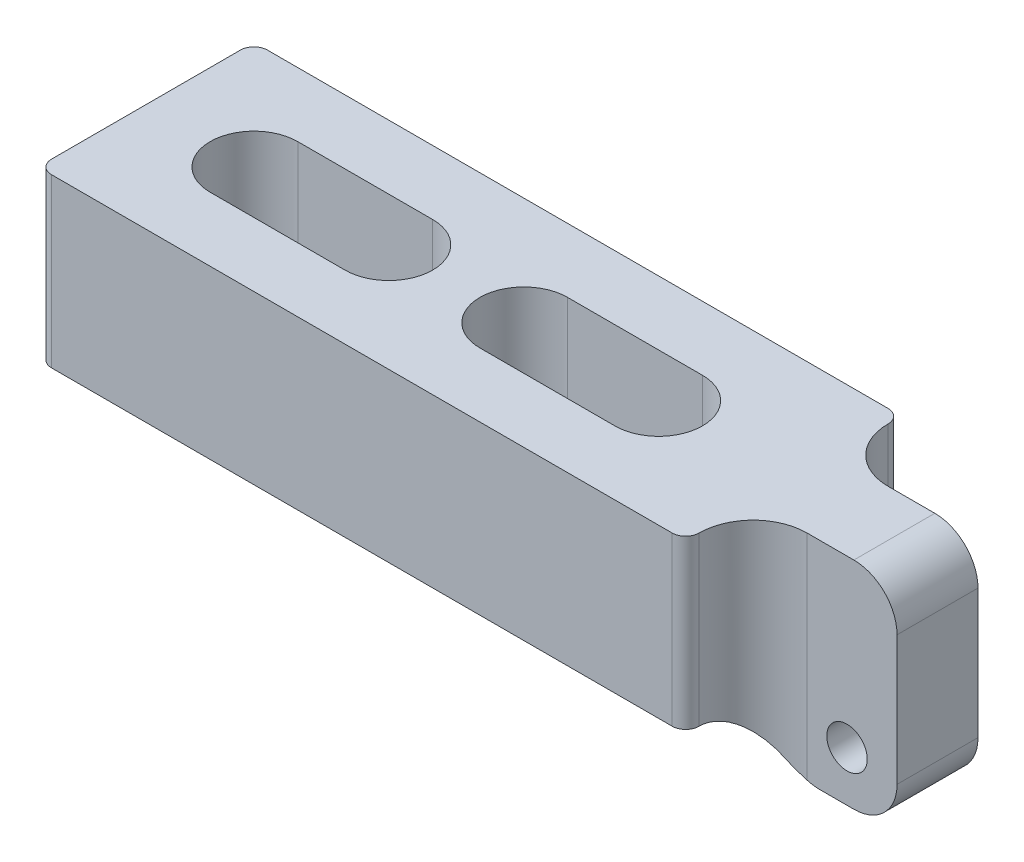
ISO-10303-21;
HEADER;
FILE_DESCRIPTION(('STEP AP214'),'2;1');
FILE_NAME('part.step','',(''),(''),'','','');
FILE_SCHEMA(('AUTOMOTIVE_DESIGN { 1 0 10303 214 1 1 1 1 }'));
ENDSEC;
DATA;
#1=APPLICATION_CONTEXT('core data for automotive mechanical design processes');
#2=APPLICATION_PROTOCOL_DEFINITION('international standard','automotive_design',2000,#1);
#3=PRODUCT_CONTEXT('',#1,'mechanical');
#4=PRODUCT('Part','Part','',(#3));
#5=PRODUCT_RELATED_PRODUCT_CATEGORY('part','',(#4));
#6=PRODUCT_DEFINITION_FORMATION('','',#4);
#7=PRODUCT_DEFINITION_CONTEXT('part definition',#1,'design');
#8=PRODUCT_DEFINITION('design','',#6,#7);
#9=PRODUCT_DEFINITION_SHAPE('','',#8);
#10=(LENGTH_UNIT() NAMED_UNIT(*) SI_UNIT(.MILLI.,.METRE.));
#11=(NAMED_UNIT(*) PLANE_ANGLE_UNIT() SI_UNIT($,.RADIAN.));
#12=(NAMED_UNIT(*) SI_UNIT($,.STERADIAN.) SOLID_ANGLE_UNIT());
#13=UNCERTAINTY_MEASURE_WITH_UNIT(LENGTH_MEASURE(1.E-05),#10,'distance_accuracy_value','');
#14=(GEOMETRIC_REPRESENTATION_CONTEXT(3) GLOBAL_UNCERTAINTY_ASSIGNED_CONTEXT((#13)) GLOBAL_UNIT_ASSIGNED_CONTEXT((#10,
#11,#12)) REPRESENTATION_CONTEXT('',''));
#15=CARTESIAN_POINT('',(0.,0.,0.));
#16=DIRECTION('',(0.,0.,1.));
#17=DIRECTION('',(1.,0.,0.));
#18=AXIS2_PLACEMENT_3D('',#15,#16,#17);
#19=CARTESIAN_POINT('',(0.,0.,12.7));
#20=DIRECTION('',(0.,0.,1.));
#21=DIRECTION('',(1.,0.,0.));
#22=AXIS2_PLACEMENT_3D('',#19,#20,#21);
#23=PLANE('',#22);
#24=DIRECTION('',(1.,0.,0.));
#25=VECTOR('',#24,1.);
#26=CARTESIAN_POINT('',(-43.6237600756682,-0.0889000000000003,12.7));
#27=LINE('',#26,#25);
#28=CARTESIAN_POINT('',(-42.8300100756682,-0.0889000000000003,12.7));
#29=VERTEX_POINT('',#28);
#30=CARTESIAN_POINT('',(-6.31751007566823,-0.0889000000000003,12.7));
#31=VERTEX_POINT('',#30);
#32=EDGE_CURVE('E249',#29,#31,#27,.T.);
#33=ORIENTED_EDGE('',*,*,#32,.T.);
#34=DIRECTION('',(0.,-1.,0.));
#35=VECTOR('',#34,1.);
#36=CARTESIAN_POINT('',(-6.31751007566821,9.75640589577104,12.7));
#37=LINE('',#36,#35);
#38=CARTESIAN_POINT('',(-6.31751007566821,9.75640589577104,12.7));
#39=VERTEX_POINT('',#38);
#40=EDGE_CURVE('E492',#31,#39,#37,.F.);
#41=ORIENTED_EDGE('',*,*,#40,.T.);
#42=DIRECTION('',(-1.,0.,0.));
#43=VECTOR('',#42,1.);
#44=CARTESIAN_POINT('',(2.94359410422896,9.75640589577104,12.7));
#45=LINE('',#44,#43);
#46=CARTESIAN_POINT('',(-42.8300100756682,9.75640589577104,12.7));
#47=VERTEX_POINT('',#46);
#48=EDGE_CURVE('E255',#39,#47,#45,.T.);
#49=ORIENTED_EDGE('',*,*,#48,.T.);
#50=DIRECTION('',(0.,-1.,0.));
#51=VECTOR('',#50,1.);
#52=CARTESIAN_POINT('',(-42.8300100756682,-0.0889000000000003,12.7));
#53=LINE('',#52,#51);
#54=EDGE_CURVE('E489',#47,#29,#53,.T.);
#55=ORIENTED_EDGE('',*,*,#54,.T.);
#56=EDGE_LOOP('',(#33,#41,#49,#55));
#57=FACE_BOUND('',#56,.T.);
#58=ADVANCED_FACE('F37',(#57),#23,.T.);
#59=CARTESIAN_POINT('',(0.,0.,0.));
#60=DIRECTION('',(0.,0.,1.));
#61=DIRECTION('',(1.,0.,0.));
#62=AXIS2_PLACEMENT_3D('',#59,#60,#61);
#63=PLANE('',#62);
#64=DIRECTION('',(-1.,0.,0.));
#65=VECTOR('',#64,1.);
#66=CARTESIAN_POINT('',(2.94359410422896,9.75640589577104,0.));
#67=LINE('',#66,#65);
#68=CARTESIAN_POINT('',(-6.31751007566821,9.75640589577104,0.));
#69=VERTEX_POINT('',#68);
#70=CARTESIAN_POINT('',(-42.8300100756682,9.75640589577104,0.));
#71=VERTEX_POINT('',#70);
#72=EDGE_CURVE('E257',#69,#71,#67,.T.);
#73=ORIENTED_EDGE('',*,*,#72,.F.);
#74=DIRECTION('',(0.,-1.,0.));
#75=VECTOR('',#74,1.);
#76=CARTESIAN_POINT('',(-6.31751007566821,0.,0.));
#77=LINE('',#76,#75);
#78=CARTESIAN_POINT('',(-6.31751007566823,-0.0889000000000003,0.));
#79=VERTEX_POINT('',#78);
#80=EDGE_CURVE('E503',#69,#79,#77,.T.);
#81=ORIENTED_EDGE('',*,*,#80,.T.);
#82=DIRECTION('',(1.,0.,0.));
#83=VECTOR('',#82,1.);
#84=CARTESIAN_POINT('',(-43.6237600756682,-0.0889000000000003,0.));
#85=LINE('',#84,#83);
#86=CARTESIAN_POINT('',(-42.8300100756682,-0.0889000000000003,0.));
#87=VERTEX_POINT('',#86);
#88=EDGE_CURVE('E259',#87,#79,#85,.T.);
#89=ORIENTED_EDGE('',*,*,#88,.F.);
#90=DIRECTION('',(0.,-1.,0.));
#91=VECTOR('',#90,1.);
#92=CARTESIAN_POINT('',(-42.8300100756682,0.,0.));
#93=LINE('',#92,#91);
#94=EDGE_CURVE('E501',#87,#71,#93,.F.);
#95=ORIENTED_EDGE('',*,*,#94,.T.);
#96=EDGE_LOOP('',(#73,#81,#89,#95));
#97=FACE_BOUND('',#96,.T.);
#98=ADVANCED_FACE('F375',(#97),#63,.F.);
#99=CARTESIAN_POINT('',(-2.66906597143926,-2.94359410422896,12.7));
#100=DIRECTION('',(0.,1.,0.));
#101=DIRECTION('',(0.,0.,1.));
#102=AXIS2_PLACEMENT_3D('',#99,#100,#101);
#103=PLANE('',#102);
#104=DIRECTION('',(1.,0.,0.));
#105=VECTOR('',#104,1.);
#106=CARTESIAN_POINT('',(2.94359410422896,-2.94359410422896,8.73125));
#107=LINE('',#106,#105);
#108=CARTESIAN_POINT('',(-1.6169635230116,-2.94359410422896,8.73125));
#109=VERTEX_POINT('',#108);
#110=CARTESIAN_POINT('',(0.403594104228956,-2.94359410422896,8.73125));
#111=VERTEX_POINT('',#110);
#112=EDGE_CURVE('E430',#109,#111,#107,.T.);
#113=ORIENTED_EDGE('',*,*,#112,.F.);
#114=DIRECTION('',(0.,0.,-1.));
#115=VECTOR('',#114,1.);
#116=CARTESIAN_POINT('',(-1.6169635230116,-2.94359410422896,12.7));
#117=LINE('',#116,#115);
#118=CARTESIAN_POINT('',(-1.6169635230116,-2.94359410422896,3.96875));
#119=VERTEX_POINT('',#118);
#120=EDGE_CURVE('E278',#109,#119,#117,.T.);
#121=ORIENTED_EDGE('',*,*,#120,.T.);
#122=DIRECTION('',(-1.,0.,0.));
#123=VECTOR('',#122,1.);
#124=CARTESIAN_POINT('',(2.94359410422896,-2.94359410422896,3.96875));
#125=LINE('',#124,#123);
#126=CARTESIAN_POINT('',(0.403594104228956,-2.94359410422896,3.96875));
#127=VERTEX_POINT('',#126);
#128=EDGE_CURVE('E232',#127,#119,#125,.T.);
#129=ORIENTED_EDGE('',*,*,#128,.F.);
#130=DIRECTION('',(0.,0.,-1.));
#131=VECTOR('',#130,1.);
#132=CARTESIAN_POINT('',(0.403594104228956,-2.94359410422896,12.7));
#133=LINE('',#132,#131);
#134=EDGE_CURVE('E270',#127,#111,#133,.F.);
#135=ORIENTED_EDGE('',*,*,#134,.T.);
#136=EDGE_LOOP('',(#113,#121,#129,#135));
#137=FACE_BOUND('',#136,.T.);
#138=ADVANCED_FACE('F339',(#137),#103,.F.);
#139=CARTESIAN_POINT('',(2.94359410422896,-2.94359410422896,12.7));
#140=DIRECTION('',(-1.,0.,0.));
#141=DIRECTION('',(0.,-1.,0.));
#142=AXIS2_PLACEMENT_3D('',#139,#140,#141);
#143=PLANE('',#142);
#144=DIRECTION('',(0.,-1.,0.));
#145=VECTOR('',#144,1.);
#146=CARTESIAN_POINT('',(2.94359410422896,9.75640589577104,8.73125));
#147=LINE('',#146,#145);
#148=CARTESIAN_POINT('',(2.94359410422896,7.21640589577104,8.73125));
#149=VERTEX_POINT('',#148);
#150=CARTESIAN_POINT('',(2.94359410422896,-0.403594104228957,8.73125));
#151=VERTEX_POINT('',#150);
#152=EDGE_CURVE('E274',#149,#151,#147,.T.);
#153=ORIENTED_EDGE('',*,*,#152,.T.);
#154=DIRECTION('',(0.,0.,-1.));
#155=VECTOR('',#154,1.);
#156=CARTESIAN_POINT('',(2.94359410422896,-0.403594104228956,12.7));
#157=LINE('',#156,#155);
#158=CARTESIAN_POINT('',(2.94359410422896,-0.403594104228957,3.96875));
#159=VERTEX_POINT('',#158);
#160=EDGE_CURVE('E299',#151,#159,#157,.T.);
#161=ORIENTED_EDGE('',*,*,#160,.T.);
#162=DIRECTION('',(0.,-1.,0.));
#163=VECTOR('',#162,1.);
#164=CARTESIAN_POINT('',(2.94359410422896,9.75640589577104,3.96875));
#165=LINE('',#164,#163);
#166=CARTESIAN_POINT('',(2.94359410422896,7.21640589577104,3.96875));
#167=VERTEX_POINT('',#166);
#168=EDGE_CURVE('E422',#167,#159,#165,.T.);
#169=ORIENTED_EDGE('',*,*,#168,.F.);
#170=DIRECTION('',(0.,0.,-1.));
#171=VECTOR('',#170,1.);
#172=CARTESIAN_POINT('',(2.94359410422896,7.21640589577104,12.7));
#173=LINE('',#172,#171);
#174=EDGE_CURVE('E297',#167,#149,#173,.F.);
#175=ORIENTED_EDGE('',*,*,#174,.T.);
#176=EDGE_LOOP('',(#153,#161,#169,#175));
#177=FACE_BOUND('',#176,.T.);
#178=ADVANCED_FACE('F399',(#177),#143,.F.);
#179=CARTESIAN_POINT('',(2.94359410422896,9.75640589577104,12.7));
#180=DIRECTION('',(0.,-1.,0.));
#181=DIRECTION('',(1.,0.,0.));
#182=AXIS2_PLACEMENT_3D('',#179,#180,#181);
#183=PLANE('',#182);
#184=DIRECTION('',(1.,0.,0.));
#185=VECTOR('',#184,1.);
#186=CARTESIAN_POINT('',(-37.2737600756682,9.75640589577104,8.9281));
#187=LINE('',#186,#185);
#188=CARTESIAN_POINT('',(-37.2737600756682,9.75640589577104,8.9281));
#189=VERTEX_POINT('',#188);
#190=CARTESIAN_POINT('',(-29.3362600756682,9.75640589577104,8.9281));
#191=VERTEX_POINT('',#190);
#192=EDGE_CURVE('E214',#189,#191,#187,.T.);
#193=ORIENTED_EDGE('',*,*,#192,.F.);
#194=CARTESIAN_POINT('',(-37.2737600756682,9.75640589577104,6.35));
#195=DIRECTION('',(0.,1.,0.));
#196=DIRECTION('',(-1.,0.,0.));
#197=AXIS2_PLACEMENT_3D('',#194,#195,#196);
#198=CIRCLE('',#197,2.5781);
#199=CARTESIAN_POINT('',(-37.2737600756682,9.75640589577104,3.7719));
#200=VERTEX_POINT('',#199);
#201=EDGE_CURVE('E219',#200,#189,#198,.T.);
#202=ORIENTED_EDGE('',*,*,#201,.F.);
#203=DIRECTION('',(-1.,0.,0.));
#204=VECTOR('',#203,1.);
#205=CARTESIAN_POINT('',(-37.2737600756682,9.75640589577104,3.7719));
#206=LINE('',#205,#204);
#207=CARTESIAN_POINT('',(-29.3362600756682,9.75640589577104,3.7719));
#208=VERTEX_POINT('',#207);
#209=EDGE_CURVE('E224',#208,#200,#206,.T.);
#210=ORIENTED_EDGE('',*,*,#209,.F.);
#211=CARTESIAN_POINT('',(-29.3362600756682,9.75640589577104,6.35));
#212=DIRECTION('',(0.,1.,0.));
#213=DIRECTION('',(-1.,0.,0.));
#214=AXIS2_PLACEMENT_3D('',#211,#212,#213);
#215=CIRCLE('',#214,2.5781);
#216=EDGE_CURVE('E203',#191,#208,#215,.T.);
#217=ORIENTED_EDGE('',*,*,#216,.F.);
#218=EDGE_LOOP('',(#193,#202,#210,#217));
#219=FACE_BOUND('',#218,.T.);
#220=DIRECTION('',(1.,0.,0.));
#221=VECTOR('',#220,1.);
#222=CARTESIAN_POINT('',(-21.3987600756682,9.75640589577104,8.9281));
#223=LINE('',#222,#221);
#224=CARTESIAN_POINT('',(-21.3987600756682,9.75640589577104,8.9281));
#225=VERTEX_POINT('',#224);
#226=CARTESIAN_POINT('',(-13.4612600756682,9.75640589577104,8.9281));
#227=VERTEX_POINT('',#226);
#228=EDGE_CURVE('E237',#225,#227,#223,.T.);
#229=ORIENTED_EDGE('',*,*,#228,.F.);
#230=CARTESIAN_POINT('',(-21.3987600756682,9.75640589577104,6.35000000000001));
#231=DIRECTION('',(0.,1.,0.));
#232=DIRECTION('',(-1.,0.,0.));
#233=AXIS2_PLACEMENT_3D('',#230,#231,#232);
#234=CIRCLE('',#233,2.5781);
#235=CARTESIAN_POINT('',(-21.3987600756682,9.75640589577104,3.7719));
#236=VERTEX_POINT('',#235);
#237=EDGE_CURVE('E234',#236,#225,#234,.T.);
#238=ORIENTED_EDGE('',*,*,#237,.F.);
#239=DIRECTION('',(-1.,0.,0.));
#240=VECTOR('',#239,1.);
#241=CARTESIAN_POINT('',(-21.3987600756682,9.75640589577104,3.7719));
#242=LINE('',#241,#240);
#243=CARTESIAN_POINT('',(-13.4612600756682,9.75640589577104,3.7719));
#244=VERTEX_POINT('',#243);
#245=EDGE_CURVE('E438',#244,#236,#242,.T.);
#246=ORIENTED_EDGE('',*,*,#245,.F.);
#247=CARTESIAN_POINT('',(-13.4612600756682,9.75640589577104,6.35));
#248=DIRECTION('',(0.,1.,0.));
#249=DIRECTION('',(-1.,0.,0.));
#250=AXIS2_PLACEMENT_3D('',#247,#248,#249);
#251=CIRCLE('',#250,2.5781);
#252=EDGE_CURVE('E241',#227,#244,#251,.T.);
#253=ORIENTED_EDGE('',*,*,#252,.F.);
#254=EDGE_LOOP('',(#229,#238,#246,#253));
#255=FACE_BOUND('',#254,.T.);
#256=ORIENTED_EDGE('',*,*,#48,.F.);
#257=CARTESIAN_POINT('',(-6.31751007566821,9.75640589577104,11.90625));
#258=DIRECTION('',(0.,-1.,0.));
#259=DIRECTION('',(1.,0.,0.));
#260=AXIS2_PLACEMENT_3D('',#257,#258,#259);
#261=CIRCLE('',#260,0.79375);
#262=CARTESIAN_POINT('',(-5.52376007566821,9.75640589577104,11.90625));
#263=VERTEX_POINT('',#262);
#264=EDGE_CURVE('E499',#39,#263,#261,.F.);
#265=ORIENTED_EDGE('',*,*,#264,.T.);
#266=CARTESIAN_POINT('',(-2.34876007566821,9.75640589577104,11.90625));
#267=DIRECTION('',(0.,-1.,0.));
#268=DIRECTION('',(1.,0.,0.));
#269=AXIS2_PLACEMENT_3D('',#266,#267,#268);
#270=CIRCLE('',#269,3.175);
#271=CARTESIAN_POINT('',(-2.34876007566821,9.75640589577104,8.73125));
#272=VERTEX_POINT('',#271);
#273=EDGE_CURVE('E522',#263,#272,#270,.T.);
#274=ORIENTED_EDGE('',*,*,#273,.T.);
#275=DIRECTION('',(1.,0.,0.));
#276=VECTOR('',#275,1.);
#277=CARTESIAN_POINT('',(2.94359410422896,9.75640589577104,8.73125));
#278=LINE('',#277,#276);
#279=CARTESIAN_POINT('',(0.403594104228956,9.75640589577104,8.73125));
#280=VERTEX_POINT('',#279);
#281=EDGE_CURVE('E414',#272,#280,#278,.T.);
#282=ORIENTED_EDGE('',*,*,#281,.T.);
#283=DIRECTION('',(0.,0.,-1.));
#284=VECTOR('',#283,1.);
#285=CARTESIAN_POINT('',(0.403594104228956,9.75640589577104,12.7));
#286=LINE('',#285,#284);
#287=CARTESIAN_POINT('',(0.403594104228956,9.75640589577104,3.96875));
#288=VERTEX_POINT('',#287);
#289=EDGE_CURVE('E302',#280,#288,#286,.T.);
#290=ORIENTED_EDGE('',*,*,#289,.T.);
#291=DIRECTION('',(-1.,0.,0.));
#292=VECTOR('',#291,1.);
#293=CARTESIAN_POINT('',(2.94359410422896,9.75640589577104,3.96875));
#294=LINE('',#293,#292);
#295=CARTESIAN_POINT('',(-2.34876007566821,9.75640589577104,3.96875));
#296=VERTEX_POINT('',#295);
#297=EDGE_CURVE('E426',#288,#296,#294,.T.);
#298=ORIENTED_EDGE('',*,*,#297,.T.);
#299=CARTESIAN_POINT('',(-2.34876007566821,9.75640589577104,0.793749999999999));
#300=DIRECTION('',(0.,-1.,0.));
#301=DIRECTION('',(1.,0.,0.));
#302=AXIS2_PLACEMENT_3D('',#299,#300,#301);
#303=CIRCLE('',#302,3.175);
#304=CARTESIAN_POINT('',(-5.52376007566821,9.75640589577104,0.793749999999998));
#305=VERTEX_POINT('',#304);
#306=EDGE_CURVE('E350',#296,#305,#303,.T.);
#307=ORIENTED_EDGE('',*,*,#306,.T.);
#308=CARTESIAN_POINT('',(-6.31751007566821,9.75640589577104,0.79375));
#309=DIRECTION('',(0.,-1.,0.));
#310=DIRECTION('',(1.,0.,0.));
#311=AXIS2_PLACEMENT_3D('',#308,#309,#310);
#312=CIRCLE('',#311,0.79375);
#313=EDGE_CURVE('E497',#305,#69,#312,.F.);
#314=ORIENTED_EDGE('',*,*,#313,.T.);
#315=ORIENTED_EDGE('',*,*,#72,.T.);
#316=CARTESIAN_POINT('',(-42.8300100756682,9.75640589577104,0.793749999999999));
#317=DIRECTION('',(0.,-1.,0.));
#318=DIRECTION('',(1.,0.,0.));
#319=AXIS2_PLACEMENT_3D('',#316,#317,#318);
#320=CIRCLE('',#319,0.79375);
#321=CARTESIAN_POINT('',(-43.6237600756682,9.75640589577104,0.793749999999999));
#322=VERTEX_POINT('',#321);
#323=EDGE_CURVE('E52',#71,#322,#320,.F.);
#324=ORIENTED_EDGE('',*,*,#323,.T.);
#325=DIRECTION('',(0.,0.,-1.));
#326=VECTOR('',#325,1.);
#327=CARTESIAN_POINT('',(-43.6237600756682,9.75640589577104,12.7));
#328=LINE('',#327,#326);
#329=CARTESIAN_POINT('',(-43.6237600756682,9.75640589577104,11.90625));
#330=VERTEX_POINT('',#329);
#331=EDGE_CURVE('E268',#330,#322,#328,.T.);
#332=ORIENTED_EDGE('',*,*,#331,.F.);
#333=CARTESIAN_POINT('',(-42.8300100756682,9.75640589577104,11.90625));
#334=DIRECTION('',(0.,-1.,0.));
#335=DIRECTION('',(1.,0.,0.));
#336=AXIS2_PLACEMENT_3D('',#333,#334,#335);
#337=CIRCLE('',#336,0.79375);
#338=EDGE_CURVE('E495',#330,#47,#337,.F.);
#339=ORIENTED_EDGE('',*,*,#338,.T.);
#340=EDGE_LOOP('',(#256,#265,#274,#282,#290,#298,#307,#314,#315,#324,#332,#339));
#341=FACE_BOUND('',#340,.T.);
#342=ADVANCED_FACE('F221',(#219,#255,#341),#183,.F.);
#343=CARTESIAN_POINT('',(-43.6237600756682,9.75640589577104,12.7));
#344=DIRECTION('',(1.,0.,0.));
#345=DIRECTION('',(0.,0.,-1.));
#346=AXIS2_PLACEMENT_3D('',#343,#344,#345);
#347=PLANE('',#346);
#348=DIRECTION('',(0.,0.,-1.));
#349=VECTOR('',#348,1.);
#350=CARTESIAN_POINT('',(-43.6237600756682,-0.0889000000000003,12.7));
#351=LINE('',#350,#349);
#352=CARTESIAN_POINT('',(-43.6237600756682,-0.0889000000000003,11.90625));
#353=VERTEX_POINT('',#352);
#354=CARTESIAN_POINT('',(-43.6237600756682,-0.0889000000000003,0.793749999999999));
#355=VERTEX_POINT('',#354);
#356=EDGE_CURVE('E264',#353,#355,#351,.T.);
#357=ORIENTED_EDGE('',*,*,#356,.F.);
#358=DIRECTION('',(0.,-1.,0.));
#359=VECTOR('',#358,1.);
#360=CARTESIAN_POINT('',(-43.6237600756682,9.75640589577104,11.90625));
#361=LINE('',#360,#359);
#362=EDGE_CURVE('E12',#353,#330,#361,.F.);
#363=ORIENTED_EDGE('',*,*,#362,.T.);
#364=ORIENTED_EDGE('',*,*,#331,.T.);
#365=DIRECTION('',(0.,-1.,0.));
#366=VECTOR('',#365,1.);
#367=CARTESIAN_POINT('',(-43.6237600756682,9.75640589577104,0.793749999999999));
#368=LINE('',#367,#366);
#369=EDGE_CURVE('E45',#322,#355,#368,.T.);
#370=ORIENTED_EDGE('',*,*,#369,.T.);
#371=EDGE_LOOP('',(#357,#363,#364,#370));
#372=FACE_BOUND('',#371,.T.);
#373=ADVANCED_FACE('F394',(#372),#347,.F.);
#374=CARTESIAN_POINT('',(-43.6237600756682,-0.0889000000000003,12.7));
#375=DIRECTION('',(0.,1.,0.));
#376=DIRECTION('',(0.,0.,1.));
#377=AXIS2_PLACEMENT_3D('',#374,#375,#376);
#378=PLANE('',#377);
#379=DIRECTION('',(-1.,0.,0.));
#380=VECTOR('',#379,1.);
#381=CARTESIAN_POINT('',(-43.6237600756682,-0.0889000000000003,3.7719));
#382=LINE('',#381,#380);
#383=CARTESIAN_POINT('',(-29.3362600756682,-0.0889000000000003,3.7719));
#384=VERTEX_POINT('',#383);
#385=CARTESIAN_POINT('',(-37.2737600756682,-0.0889000000000003,3.7719));
#386=VERTEX_POINT('',#385);
#387=EDGE_CURVE('E475',#384,#386,#382,.T.);
#388=ORIENTED_EDGE('',*,*,#387,.T.);
#389=CARTESIAN_POINT('',(-37.2737600756682,-0.0889000000000003,6.35));
#390=DIRECTION('',(0.,1.,0.));
#391=DIRECTION('',(0.,0.,1.));
#392=AXIS2_PLACEMENT_3D('',#389,#390,#391);
#393=CIRCLE('',#392,2.5781);
#394=CARTESIAN_POINT('',(-37.2737600756682,-0.0889000000000003,8.9281));
#395=VERTEX_POINT('',#394);
#396=EDGE_CURVE('E478',#386,#395,#393,.T.);
#397=ORIENTED_EDGE('',*,*,#396,.T.);
#398=DIRECTION('',(1.,0.,0.));
#399=VECTOR('',#398,1.);
#400=CARTESIAN_POINT('',(-43.6237600756682,-0.0889000000000003,8.9281));
#401=LINE('',#400,#399);
#402=CARTESIAN_POINT('',(-29.3362600756682,-0.0889000000000003,8.9281));
#403=VERTEX_POINT('',#402);
#404=EDGE_CURVE('E472',#395,#403,#401,.T.);
#405=ORIENTED_EDGE('',*,*,#404,.T.);
#406=CARTESIAN_POINT('',(-29.3362600756682,-0.0889000000000003,6.35));
#407=DIRECTION('',(0.,1.,0.));
#408=DIRECTION('',(0.,0.,1.));
#409=AXIS2_PLACEMENT_3D('',#406,#407,#408);
#410=CIRCLE('',#409,2.5781);
#411=EDGE_CURVE('E206',#403,#384,#410,.T.);
#412=ORIENTED_EDGE('',*,*,#411,.T.);
#413=EDGE_LOOP('',(#388,#397,#405,#412));
#414=FACE_BOUND('',#413,.T.);
#415=DIRECTION('',(-1.,0.,0.));
#416=VECTOR('',#415,1.);
#417=CARTESIAN_POINT('',(-43.6237600756682,-0.0889000000000003,3.7719));
#418=LINE('',#417,#416);
#419=CARTESIAN_POINT('',(-13.4612600756682,-0.0889000000000003,3.7719));
#420=VERTEX_POINT('',#419);
#421=CARTESIAN_POINT('',(-21.3987600756682,-0.0889000000000003,3.7719));
#422=VERTEX_POINT('',#421);
#423=EDGE_CURVE('E465',#420,#422,#418,.T.);
#424=ORIENTED_EDGE('',*,*,#423,.T.);
#425=CARTESIAN_POINT('',(-21.3987600756682,-0.0889000000000003,6.35000000000001));
#426=DIRECTION('',(0.,1.,0.));
#427=DIRECTION('',(0.,0.,1.));
#428=AXIS2_PLACEMENT_3D('',#425,#426,#427);
#429=CIRCLE('',#428,2.5781);
#430=CARTESIAN_POINT('',(-21.3987600756682,-0.0889000000000003,8.9281));
#431=VERTEX_POINT('',#430);
#432=EDGE_CURVE('E470',#422,#431,#429,.T.);
#433=ORIENTED_EDGE('',*,*,#432,.T.);
#434=DIRECTION('',(1.,0.,0.));
#435=VECTOR('',#434,1.);
#436=CARTESIAN_POINT('',(-43.6237600756682,-0.0889000000000003,8.9281));
#437=LINE('',#436,#435);
#438=CARTESIAN_POINT('',(-13.4612600756682,-0.0889000000000003,8.9281));
#439=VERTEX_POINT('',#438);
#440=EDGE_CURVE('E462',#431,#439,#437,.T.);
#441=ORIENTED_EDGE('',*,*,#440,.T.);
#442=CARTESIAN_POINT('',(-13.4612600756682,-0.0889000000000003,6.35));
#443=DIRECTION('',(0.,1.,0.));
#444=DIRECTION('',(0.,0.,1.));
#445=AXIS2_PLACEMENT_3D('',#442,#443,#444);
#446=CIRCLE('',#445,2.5781);
#447=EDGE_CURVE('E464',#439,#420,#446,.T.);
#448=ORIENTED_EDGE('',*,*,#447,.T.);
#449=EDGE_LOOP('',(#424,#433,#441,#448));
#450=FACE_BOUND('',#449,.T.);
#451=DIRECTION('',(0.,0.,-1.));
#452=VECTOR('',#451,1.);
#453=CARTESIAN_POINT('',(-5.52376007566821,-0.0889000000000003,12.7));
#454=LINE('',#453,#452);
#455=CARTESIAN_POINT('',(-5.52376007566821,-0.0889000000000003,11.90625));
#456=VERTEX_POINT('',#455);
#457=CARTESIAN_POINT('',(-5.52376007566821,-0.0889000000000003,0.793749999999999));
#458=VERTEX_POINT('',#457);
#459=EDGE_CURVE('E254',#456,#458,#454,.T.);
#460=ORIENTED_EDGE('',*,*,#459,.F.);
#461=CARTESIAN_POINT('',(-6.31751007566821,-0.0888999999999994,11.90625));
#462=DIRECTION('',(0.,1.,0.));
#463=DIRECTION('',(0.,0.,1.));
#464=AXIS2_PLACEMENT_3D('',#461,#462,#463);
#465=CIRCLE('',#464,0.79375);
#466=EDGE_CURVE('E487',#456,#31,#465,.F.);
#467=ORIENTED_EDGE('',*,*,#466,.T.);
#468=ORIENTED_EDGE('',*,*,#32,.F.);
#469=CARTESIAN_POINT('',(-42.8300100756682,-0.0889000000000003,11.90625));
#470=DIRECTION('',(0.,1.,0.));
#471=DIRECTION('',(0.,0.,1.));
#472=AXIS2_PLACEMENT_3D('',#469,#470,#471);
#473=CIRCLE('',#472,0.79375);
#474=EDGE_CURVE('E483',#29,#353,#473,.F.);
#475=ORIENTED_EDGE('',*,*,#474,.T.);
#476=ORIENTED_EDGE('',*,*,#356,.T.);
#477=CARTESIAN_POINT('',(-42.8300100756682,-0.0889000000000011,0.793749999999999));
#478=DIRECTION('',(0.,1.,0.));
#479=DIRECTION('',(0.,0.,1.));
#480=AXIS2_PLACEMENT_3D('',#477,#478,#479);
#481=CIRCLE('',#480,0.79375);
#482=EDGE_CURVE('E481',#355,#87,#481,.F.);
#483=ORIENTED_EDGE('',*,*,#482,.T.);
#484=ORIENTED_EDGE('',*,*,#88,.T.);
#485=CARTESIAN_POINT('',(-6.31751007566821,-0.0889000000000003,0.79375));
#486=DIRECTION('',(0.,1.,0.));
#487=DIRECTION('',(0.,0.,1.));
#488=AXIS2_PLACEMENT_3D('',#485,#486,#487);
#489=CIRCLE('',#488,0.79375);
#490=EDGE_CURVE('E485',#79,#458,#489,.F.);
#491=ORIENTED_EDGE('',*,*,#490,.T.);
#492=EDGE_LOOP('',(#460,#467,#468,#475,#476,#483,#484,#491));
#493=FACE_BOUND('',#492,.T.);
#494=ADVANCED_FACE('F390',(#414,#450,#493),#378,.F.);
#495=CARTESIAN_POINT('',(-5.52376007566821,-0.0889000000000003,12.7));
#496=DIRECTION('',(0.707106781186549,0.707106781186546,0.));
#497=DIRECTION('',(-0.707106781186546,0.707106781186549,0.));
#498=AXIS2_PLACEMENT_3D('',#495,#496,#497);
#499=PLANE('',#498);
#500=ORIENTED_EDGE('',*,*,#459,.T.);
#501=CARTESIAN_POINT('',(-2.34876007566821,-3.26390000000001,0.793749999999999));
#502=DIRECTION('',(0.707106781186549,0.707106781186546,0.));
#503=DIRECTION('',(-0.707106781186546,0.707106781186549,0.));
#504=AXIS2_PLACEMENT_3D('',#501,#502,#503);
#505=ELLIPSE('',#504,4.49012806053458,3.175);
#506=CARTESIAN_POINT('',(-3.41301474722543,-2.19964532844278,3.78506860457375));
#507=VERTEX_POINT('',#506);
#508=EDGE_CURVE('E351',#458,#507,#505,.T.);
#509=ORIENTED_EDGE('',*,*,#508,.T.);
#510=DIRECTION('',(0.,0.,-1.));
#511=VECTOR('',#510,1.);
#512=CARTESIAN_POINT('',(-3.41301474722543,-2.19964532844278,12.7));
#513=LINE('',#512,#511);
#514=CARTESIAN_POINT('',(-3.41301474722543,-2.19964532844278,8.91493139542625));
#515=VERTEX_POINT('',#514);
#516=EDGE_CURVE('E288',#507,#515,#513,.F.);
#517=ORIENTED_EDGE('',*,*,#516,.T.);
#518=CARTESIAN_POINT('',(-2.34876007566821,-3.26390000000001,11.90625));
#519=DIRECTION('',(0.707106781186549,0.707106781186546,0.));
#520=DIRECTION('',(-0.707106781186546,0.707106781186549,0.));
#521=AXIS2_PLACEMENT_3D('',#518,#519,#520);
#522=ELLIPSE('',#521,4.49012806053458,3.175);
#523=EDGE_CURVE('E325',#515,#456,#522,.T.);
#524=ORIENTED_EDGE('',*,*,#523,.T.);
#525=EDGE_LOOP('',(#500,#509,#517,#524));
#526=FACE_BOUND('',#525,.T.);
#527=ADVANCED_FACE('F386',(#526),#499,.F.);
#528=CARTESIAN_POINT('',(2.94359410422896,9.75640589577104,3.96875));
#529=DIRECTION('',(0.,0.,1.));
#530=DIRECTION('',(1.,0.,0.));
#531=AXIS2_PLACEMENT_3D('',#528,#529,#530);
#532=PLANE('',#531);
#533=CARTESIAN_POINT('',(0.,0.,3.96875));
#534=DIRECTION('',(0.,0.,1.));
#535=DIRECTION('',(1.,0.,0.));
#536=AXIS2_PLACEMENT_3D('',#533,#534,#535);
#537=CIRCLE('',#536,1.190625);
#538=CARTESIAN_POINT('',(1.190625,0.,3.96875));
#539=VERTEX_POINT('',#538);
#540=EDGE_CURVE('E271',#539,#539,#537,.T.);
#541=ORIENTED_EDGE('',*,*,#540,.T.);
#542=EDGE_LOOP('',(#541));
#543=FACE_BOUND('',#542,.T.);
#544=CARTESIAN_POINT('',(-1.6169635230116,-0.403594104228956,3.96875));
#545=DIRECTION('',(0.,0.,1.));
#546=DIRECTION('',(1.,0.,0.));
#547=AXIS2_PLACEMENT_3D('',#544,#545,#546);
#548=CIRCLE('',#547,2.54);
#549=CARTESIAN_POINT('',(-2.34876007566821,-2.83589215453445,3.96875));
#550=VERTEX_POINT('',#549);
#551=EDGE_CURVE('E285',#119,#550,#548,.F.);
#552=ORIENTED_EDGE('',*,*,#551,.T.);
#553=DIRECTION('',(0.,-1.,0.));
#554=VECTOR('',#553,1.);
#555=CARTESIAN_POINT('',(-2.34876007566821,9.75640589577104,3.96875));
#556=LINE('',#555,#554);
#557=EDGE_CURVE('E314',#550,#296,#556,.F.);
#558=ORIENTED_EDGE('',*,*,#557,.T.);
#559=ORIENTED_EDGE('',*,*,#297,.F.);
#560=CARTESIAN_POINT('',(0.403594104228956,7.21640589577104,3.96875));
#561=DIRECTION('',(0.,0.,1.));
#562=DIRECTION('',(1.,0.,0.));
#563=AXIS2_PLACEMENT_3D('',#560,#561,#562);
#564=CIRCLE('',#563,2.54);
#565=EDGE_CURVE('E281',#288,#167,#564,.F.);
#566=ORIENTED_EDGE('',*,*,#565,.T.);
#567=ORIENTED_EDGE('',*,*,#168,.T.);
#568=CARTESIAN_POINT('',(0.403594104228956,-0.403594104228956,3.96875));
#569=DIRECTION('',(0.,0.,1.));
#570=DIRECTION('',(1.,0.,0.));
#571=AXIS2_PLACEMENT_3D('',#568,#569,#570);
#572=CIRCLE('',#571,2.54);
#573=EDGE_CURVE('E283',#159,#127,#572,.F.);
#574=ORIENTED_EDGE('',*,*,#573,.T.);
#575=ORIENTED_EDGE('',*,*,#128,.T.);
#576=EDGE_LOOP('',(#552,#558,#559,#566,#567,#574,#575));
#577=FACE_BOUND('',#576,.T.);
#578=ADVANCED_FACE('F389',(#543,#577),#532,.F.);
#579=CARTESIAN_POINT('',(2.94359410422896,9.75640589577104,8.73125));
#580=DIRECTION('',(0.,0.,-1.));
#581=DIRECTION('',(-1.,0.,0.));
#582=AXIS2_PLACEMENT_3D('',#579,#580,#581);
#583=PLANE('',#582);
#584=CARTESIAN_POINT('',(0.,0.,8.73125));
#585=DIRECTION('',(0.,0.,-1.));
#586=DIRECTION('',(-1.,0.,0.));
#587=AXIS2_PLACEMENT_3D('',#584,#585,#586);
#588=CIRCLE('',#587,1.190625);
#589=CARTESIAN_POINT('',(-1.190625,0.,8.73125));
#590=VERTEX_POINT('',#589);
#591=EDGE_CURVE('E260',#590,#590,#588,.T.);
#592=ORIENTED_EDGE('',*,*,#591,.T.);
#593=EDGE_LOOP('',(#592));
#594=FACE_BOUND('',#593,.T.);
#595=ORIENTED_EDGE('',*,*,#281,.F.);
#596=DIRECTION('',(0.,-1.,0.));
#597=VECTOR('',#596,1.);
#598=CARTESIAN_POINT('',(-2.34876007566821,-0.0888999999999994,8.73125));
#599=LINE('',#598,#597);
#600=CARTESIAN_POINT('',(-2.34876007566821,-2.83589215453445,8.73125));
#601=VERTEX_POINT('',#600);
#602=EDGE_CURVE('E305',#272,#601,#599,.T.);
#603=ORIENTED_EDGE('',*,*,#602,.T.);
#604=CARTESIAN_POINT('',(-1.6169635230116,-0.403594104228956,8.73125));
#605=DIRECTION('',(0.,0.,-1.));
#606=DIRECTION('',(-1.,0.,0.));
#607=AXIS2_PLACEMENT_3D('',#604,#605,#606);
#608=CIRCLE('',#607,2.54);
#609=EDGE_CURVE('E295',#601,#109,#608,.F.);
#610=ORIENTED_EDGE('',*,*,#609,.T.);
#611=ORIENTED_EDGE('',*,*,#112,.T.);
#612=CARTESIAN_POINT('',(0.403594104228956,-0.403594104228956,8.73125));
#613=DIRECTION('',(0.,0.,-1.));
#614=DIRECTION('',(-1.,0.,0.));
#615=AXIS2_PLACEMENT_3D('',#612,#613,#614);
#616=CIRCLE('',#615,2.54);
#617=EDGE_CURVE('E293',#111,#151,#616,.F.);
#618=ORIENTED_EDGE('',*,*,#617,.T.);
#619=ORIENTED_EDGE('',*,*,#152,.F.);
#620=CARTESIAN_POINT('',(0.403594104228956,7.21640589577104,8.73125));
#621=DIRECTION('',(0.,0.,-1.));
#622=DIRECTION('',(-1.,0.,0.));
#623=AXIS2_PLACEMENT_3D('',#620,#621,#622);
#624=CIRCLE('',#623,2.54);
#625=EDGE_CURVE('E290',#149,#280,#624,.F.);
#626=ORIENTED_EDGE('',*,*,#625,.T.);
#627=EDGE_LOOP('',(#595,#603,#610,#611,#618,#619,#626));
#628=FACE_BOUND('',#627,.T.);
#629=ADVANCED_FACE('F528',(#594,#628),#583,.F.);
#630=CARTESIAN_POINT('',(0.,0.,12.7));
#631=DIRECTION('',(0.,0.,-1.));
#632=DIRECTION('',(-1.,0.,0.));
#633=AXIS2_PLACEMENT_3D('',#630,#631,#632);
#634=CYLINDRICAL_SURFACE('',#633,1.190625);
#635=ORIENTED_EDGE('',*,*,#591,.F.);
#636=EDGE_LOOP('',(#635));
#637=FACE_BOUND('',#636,.T.);
#638=ORIENTED_EDGE('',*,*,#540,.F.);
#639=EDGE_LOOP('',(#638));
#640=FACE_BOUND('',#639,.T.);
#641=ADVANCED_FACE('F337',(#637,#640),#634,.F.);
#642=CARTESIAN_POINT('',(-1.6169635230116,-0.403594104228956,12.7));
#643=DIRECTION('',(0.,0.,-1.));
#644=DIRECTION('',(-1.,0.,0.));
#645=AXIS2_PLACEMENT_3D('',#642,#643,#644);
#646=CYLINDRICAL_SURFACE('',#645,2.54);
#647=ORIENTED_EDGE('',*,*,#609,.F.);
#648=CARTESIAN_POINT('',(-2.34876007566821,-2.83589215453445,8.73125));
#649=CARTESIAN_POINT('',(-2.41186412228856,-2.81692066961694,8.73123706749515));
#650=CARTESIAN_POINT('',(-2.47419864575183,-2.79547493156938,8.73313064386332));
#651=CARTESIAN_POINT('',(-2.59680202479447,-2.74791011925003,8.74036215150307));
#652=CARTESIAN_POINT('',(-2.6570724061308,-2.72179458965319,8.7456974782174));
#653=CARTESIAN_POINT('',(-2.77382605223159,-2.66575587442809,8.75929448490326));
#654=CARTESIAN_POINT('',(-2.83036333062601,-2.63592852435568,8.76748956824909));
#655=CARTESIAN_POINT('',(-2.94070680120521,-2.57231693915393,8.78641710416036));
#656=CARTESIAN_POINT('',(-2.99451318619768,-2.53853298392908,8.79714937729051));
#657=CARTESIAN_POINT('',(-3.11242577909258,-2.45822089462871,8.82372542913645));
#658=CARTESIAN_POINT('',(-3.17567600653282,-2.41063554265427,8.8401751116718));
#659=CARTESIAN_POINT('',(-3.29794412037148,-2.30945315415526,8.87577093029146));
#660=CARTESIAN_POINT('',(-3.35688956015929,-2.25578066142077,8.89495188863868));
#661=CARTESIAN_POINT('',(-3.41301474722543,-2.19964532844279,8.91493139542632));
#662=B_SPLINE_CURVE_WITH_KNOTS('',3,(#648,#649,#650,#651,#652,#653,#654,#655,#656,#657,#658,
#659,#660,#661),.UNSPECIFIED.,.F.,.F.,(4,2,2,2,2,2,4),(0.,0.197569110795993,0.394988885553564,
0.588088252698825,0.781173967542356,1.02331209880193,1.26887225675344),.UNSPECIFIED.);
#663=EDGE_CURVE('E316',#601,#515,#662,.T.);
#664=ORIENTED_EDGE('',*,*,#663,.T.);
#665=ORIENTED_EDGE('',*,*,#516,.F.);
#666=CARTESIAN_POINT('',(-3.41301474722543,-2.19964532844278,3.78506860457375));
#667=CARTESIAN_POINT('',(-3.36778190346096,-2.2448678033379,3.80115924423149));
#668=CARTESIAN_POINT('',(-3.32077541086263,-2.28846445624939,3.81672800434245));
#669=CARTESIAN_POINT('',(-3.22327094596361,-2.37222997197538,3.846365875755));
#670=CARTESIAN_POINT('',(-3.17276932194578,-2.41239514864698,3.86043337832479));
#671=CARTESIAN_POINT('',(-3.01879652134267,-2.52547336509704,3.89901172145307));
#672=CARTESIAN_POINT('',(-2.91063781502737,-2.59319123537725,3.92072666874683));
#673=CARTESIAN_POINT('',(-2.72666136457217,-2.68976348246215,3.94699178052937));
#674=CARTESIAN_POINT('',(-2.65392057756012,-2.7236700657742,3.95492498379756));
#675=CARTESIAN_POINT('',(-2.50415412491076,-2.78501341524972,3.9658515452706));
#676=CARTESIAN_POINT('',(-2.42708116393863,-2.81234765712332,3.96877051035037));
#677=CARTESIAN_POINT('',(-2.34876007566821,-2.83589215453445,3.96875));
#678=B_SPLINE_CURVE_WITH_KNOTS('',3,(#666,#667,#668,#669,#670,#671,#672,#673,#674,#675,#676,
#677),.UNSPECIFIED.,.F.,.F.,(4,2,2,2,2,4),(0.,0.197757470540063,0.395724771864235,
0.782017749785304,1.02349046803041,1.26851578138762),.UNSPECIFIED.);
#679=EDGE_CURVE('E343',#507,#550,#678,.T.);
#680=ORIENTED_EDGE('',*,*,#679,.T.);
#681=ORIENTED_EDGE('',*,*,#551,.F.);
#682=ORIENTED_EDGE('',*,*,#120,.F.);
#683=EDGE_LOOP('',(#647,#664,#665,#680,#681,#682));
#684=FACE_BOUND('',#683,.T.);
#685=ADVANCED_FACE('F331',(#684),#646,.T.);
#686=CARTESIAN_POINT('',(0.403594104228956,-0.403594104228956,12.7));
#687=DIRECTION('',(0.,0.,-1.));
#688=DIRECTION('',(-1.,0.,0.));
#689=AXIS2_PLACEMENT_3D('',#686,#687,#688);
#690=CYLINDRICAL_SURFACE('',#689,2.54);
#691=ORIENTED_EDGE('',*,*,#617,.F.);
#692=ORIENTED_EDGE('',*,*,#134,.F.);
#693=ORIENTED_EDGE('',*,*,#573,.F.);
#694=ORIENTED_EDGE('',*,*,#160,.F.);
#695=EDGE_LOOP('',(#691,#692,#693,#694));
#696=FACE_BOUND('',#695,.T.);
#697=ADVANCED_FACE('F336',(#696),#690,.T.);
#698=CARTESIAN_POINT('',(0.403594104228956,7.21640589577104,12.7));
#699=DIRECTION('',(0.,0.,-1.));
#700=DIRECTION('',(-1.,0.,0.));
#701=AXIS2_PLACEMENT_3D('',#698,#699,#700);
#702=CYLINDRICAL_SURFACE('',#701,2.54);
#703=ORIENTED_EDGE('',*,*,#625,.F.);
#704=ORIENTED_EDGE('',*,*,#174,.F.);
#705=ORIENTED_EDGE('',*,*,#565,.F.);
#706=ORIENTED_EDGE('',*,*,#289,.F.);
#707=EDGE_LOOP('',(#703,#704,#705,#706));
#708=FACE_BOUND('',#707,.T.);
#709=ADVANCED_FACE('F539',(#708),#702,.T.);
#710=CARTESIAN_POINT('',(-2.34876007566821,9.75640589577104,11.90625));
#711=DIRECTION('',(0.,1.,0.));
#712=DIRECTION('',(0.,0.,1.));
#713=AXIS2_PLACEMENT_3D('',#710,#711,#712);
#714=CYLINDRICAL_SURFACE('',#713,3.175);
#715=ORIENTED_EDGE('',*,*,#273,.F.);
#716=DIRECTION('',(0.,-1.,0.));
#717=VECTOR('',#716,1.);
#718=CARTESIAN_POINT('',(-5.52376007566821,9.75640589577104,11.90625));
#719=LINE('',#718,#717);
#720=EDGE_CURVE('E308',#456,#263,#719,.F.);
#721=ORIENTED_EDGE('',*,*,#720,.F.);
#722=ORIENTED_EDGE('',*,*,#523,.F.);
#723=ORIENTED_EDGE('',*,*,#663,.F.);
#724=ORIENTED_EDGE('',*,*,#602,.F.);
#725=EDGE_LOOP('',(#715,#721,#722,#723,#724));
#726=FACE_BOUND('',#725,.T.);
#727=ADVANCED_FACE('F327',(#726),#714,.F.);
#728=CARTESIAN_POINT('',(-2.34876007566821,9.75640589577104,0.793749999999999));
#729=DIRECTION('',(0.,1.,0.));
#730=DIRECTION('',(0.,0.,1.));
#731=AXIS2_PLACEMENT_3D('',#728,#729,#730);
#732=CYLINDRICAL_SURFACE('',#731,3.175);
#733=ORIENTED_EDGE('',*,*,#306,.F.);
#734=ORIENTED_EDGE('',*,*,#557,.F.);
#735=ORIENTED_EDGE('',*,*,#679,.F.);
#736=ORIENTED_EDGE('',*,*,#508,.F.);
#737=DIRECTION('',(0.,-1.,0.));
#738=VECTOR('',#737,1.);
#739=CARTESIAN_POINT('',(-5.52376007566821,-0.0888999999999994,0.793749999999998));
#740=LINE('',#739,#738);
#741=EDGE_CURVE('E311',#305,#458,#740,.T.);
#742=ORIENTED_EDGE('',*,*,#741,.F.);
#743=EDGE_LOOP('',(#733,#734,#735,#736,#742));
#744=FACE_BOUND('',#743,.T.);
#745=ADVANCED_FACE('F353',(#744),#732,.F.);
#746=CARTESIAN_POINT('',(-21.3987600756682,-2.94359410422896,6.35000000000001));
#747=DIRECTION('',(0.,1.,0.));
#748=DIRECTION('',(-1.,0.,0.));
#749=AXIS2_PLACEMENT_3D('',#746,#747,#748);
#750=CYLINDRICAL_SURFACE('',#749,2.5781);
#751=DIRECTION('',(0.,1.,0.));
#752=VECTOR('',#751,1.);
#753=CARTESIAN_POINT('',(-21.3987600756682,-2.94359410422896,3.7719));
#754=LINE('',#753,#752);
#755=EDGE_CURVE('E442',#422,#236,#754,.T.);
#756=ORIENTED_EDGE('',*,*,#755,.T.);
#757=ORIENTED_EDGE('',*,*,#237,.T.);
#758=DIRECTION('',(0.,1.,0.));
#759=VECTOR('',#758,1.);
#760=CARTESIAN_POINT('',(-21.3987600756682,-2.94359410422896,8.9281));
#761=LINE('',#760,#759);
#762=EDGE_CURVE('E434',#431,#225,#761,.T.);
#763=ORIENTED_EDGE('',*,*,#762,.F.);
#764=ORIENTED_EDGE('',*,*,#432,.F.);
#765=EDGE_LOOP('',(#756,#757,#763,#764));
#766=FACE_BOUND('',#765,.T.);
#767=ADVANCED_FACE('F357',(#766),#750,.F.);
#768=CARTESIAN_POINT('',(-21.3987600756682,-2.94359410422896,3.7719));
#769=DIRECTION('',(0.,0.,-1.));
#770=DIRECTION('',(-1.,0.,0.));
#771=AXIS2_PLACEMENT_3D('',#768,#769,#770);
#772=PLANE('',#771);
#773=DIRECTION('',(0.,1.,0.));
#774=VECTOR('',#773,1.);
#775=CARTESIAN_POINT('',(-13.4612600756682,-2.94359410422896,3.7719));
#776=LINE('',#775,#774);
#777=EDGE_CURVE('E440',#420,#244,#776,.T.);
#778=ORIENTED_EDGE('',*,*,#777,.T.);
#779=ORIENTED_EDGE('',*,*,#245,.T.);
#780=ORIENTED_EDGE('',*,*,#755,.F.);
#781=ORIENTED_EDGE('',*,*,#423,.F.);
#782=EDGE_LOOP('',(#778,#779,#780,#781));
#783=FACE_BOUND('',#782,.T.);
#784=ADVANCED_FACE('F655',(#783),#772,.F.);
#785=CARTESIAN_POINT('',(-13.4612600756682,-2.94359410422896,6.35));
#786=DIRECTION('',(0.,1.,0.));
#787=DIRECTION('',(-1.,0.,0.));
#788=AXIS2_PLACEMENT_3D('',#785,#786,#787);
#789=CYLINDRICAL_SURFACE('',#788,2.5781);
#790=DIRECTION('',(0.,1.,0.));
#791=VECTOR('',#790,1.);
#792=CARTESIAN_POINT('',(-13.4612600756682,-2.94359410422896,8.9281));
#793=LINE('',#792,#791);
#794=EDGE_CURVE('E437',#439,#227,#793,.T.);
#795=ORIENTED_EDGE('',*,*,#794,.T.);
#796=ORIENTED_EDGE('',*,*,#252,.T.);
#797=ORIENTED_EDGE('',*,*,#777,.F.);
#798=ORIENTED_EDGE('',*,*,#447,.F.);
#799=EDGE_LOOP('',(#795,#796,#797,#798));
#800=FACE_BOUND('',#799,.T.);
#801=ADVANCED_FACE('F452',(#800),#789,.F.);
#802=CARTESIAN_POINT('',(-21.3987600756682,-2.94359410422896,8.9281));
#803=DIRECTION('',(0.,0.,1.));
#804=DIRECTION('',(1.,0.,0.));
#805=AXIS2_PLACEMENT_3D('',#802,#803,#804);
#806=PLANE('',#805);
#807=ORIENTED_EDGE('',*,*,#762,.T.);
#808=ORIENTED_EDGE('',*,*,#228,.T.);
#809=ORIENTED_EDGE('',*,*,#794,.F.);
#810=ORIENTED_EDGE('',*,*,#440,.F.);
#811=EDGE_LOOP('',(#807,#808,#809,#810));
#812=FACE_BOUND('',#811,.T.);
#813=ADVANCED_FACE('F460',(#812),#806,.F.);
#814=CARTESIAN_POINT('',(-37.2737600756682,-2.94359410422896,6.35));
#815=DIRECTION('',(0.,1.,0.));
#816=DIRECTION('',(-1.,0.,0.));
#817=AXIS2_PLACEMENT_3D('',#814,#815,#816);
#818=CYLINDRICAL_SURFACE('',#817,2.5781);
#819=DIRECTION('',(0.,1.,0.));
#820=VECTOR('',#819,1.);
#821=CARTESIAN_POINT('',(-37.2737600756682,-2.94359410422896,3.7719));
#822=LINE('',#821,#820);
#823=EDGE_CURVE('E230',#386,#200,#822,.T.);
#824=ORIENTED_EDGE('',*,*,#823,.T.);
#825=ORIENTED_EDGE('',*,*,#201,.T.);
#826=DIRECTION('',(0.,1.,0.));
#827=VECTOR('',#826,1.);
#828=CARTESIAN_POINT('',(-37.2737600756682,-2.94359410422896,8.9281));
#829=LINE('',#828,#827);
#830=EDGE_CURVE('E210',#395,#189,#829,.T.);
#831=ORIENTED_EDGE('',*,*,#830,.F.);
#832=ORIENTED_EDGE('',*,*,#396,.F.);
#833=EDGE_LOOP('',(#824,#825,#831,#832));
#834=FACE_BOUND('',#833,.T.);
#835=ADVANCED_FACE('F628',(#834),#818,.F.);
#836=CARTESIAN_POINT('',(-37.2737600756682,-2.94359410422896,3.7719));
#837=DIRECTION('',(0.,0.,-1.));
#838=DIRECTION('',(-1.,0.,0.));
#839=AXIS2_PLACEMENT_3D('',#836,#837,#838);
#840=PLANE('',#839);
#841=DIRECTION('',(0.,1.,0.));
#842=VECTOR('',#841,1.);
#843=CARTESIAN_POINT('',(-29.3362600756682,-2.94359410422896,3.7719));
#844=LINE('',#843,#842);
#845=EDGE_CURVE('E209',#384,#208,#844,.T.);
#846=ORIENTED_EDGE('',*,*,#845,.T.);
#847=ORIENTED_EDGE('',*,*,#209,.T.);
#848=ORIENTED_EDGE('',*,*,#823,.F.);
#849=ORIENTED_EDGE('',*,*,#387,.F.);
#850=EDGE_LOOP('',(#846,#847,#848,#849));
#851=FACE_BOUND('',#850,.T.);
#852=ADVANCED_FACE('F619',(#851),#840,.F.);
#853=CARTESIAN_POINT('',(-29.3362600756682,-2.94359410422896,6.35));
#854=DIRECTION('',(0.,1.,0.));
#855=DIRECTION('',(-1.,0.,0.));
#856=AXIS2_PLACEMENT_3D('',#853,#854,#855);
#857=CYLINDRICAL_SURFACE('',#856,2.5781);
#858=DIRECTION('',(0.,1.,0.));
#859=VECTOR('',#858,1.);
#860=CARTESIAN_POINT('',(-29.3362600756682,-2.94359410422896,8.9281));
#861=LINE('',#860,#859);
#862=EDGE_CURVE('E198',#403,#191,#861,.T.);
#863=ORIENTED_EDGE('',*,*,#862,.T.);
#864=ORIENTED_EDGE('',*,*,#216,.T.);
#865=ORIENTED_EDGE('',*,*,#845,.F.);
#866=ORIENTED_EDGE('',*,*,#411,.F.);
#867=EDGE_LOOP('',(#863,#864,#865,#866));
#868=FACE_BOUND('',#867,.T.);
#869=ADVANCED_FACE('F200',(#868),#857,.F.);
#870=CARTESIAN_POINT('',(-37.2737600756682,-2.94359410422896,8.9281));
#871=DIRECTION('',(0.,0.,1.));
#872=DIRECTION('',(1.,0.,0.));
#873=AXIS2_PLACEMENT_3D('',#870,#871,#872);
#874=PLANE('',#873);
#875=ORIENTED_EDGE('',*,*,#830,.T.);
#876=ORIENTED_EDGE('',*,*,#192,.T.);
#877=ORIENTED_EDGE('',*,*,#862,.F.);
#878=ORIENTED_EDGE('',*,*,#404,.F.);
#879=EDGE_LOOP('',(#875,#876,#877,#878));
#880=FACE_BOUND('',#879,.T.);
#881=ADVANCED_FACE('F215',(#880),#874,.F.);
#882=CARTESIAN_POINT('',(-6.31751007566821,9.75640589577104,11.90625));
#883=DIRECTION('',(0.,1.,0.));
#884=DIRECTION('',(0.,0.,1.));
#885=AXIS2_PLACEMENT_3D('',#882,#883,#884);
#886=CYLINDRICAL_SURFACE('',#885,0.79375);
#887=ORIENTED_EDGE('',*,*,#264,.F.);
#888=ORIENTED_EDGE('',*,*,#40,.F.);
#889=ORIENTED_EDGE('',*,*,#466,.F.);
#890=ORIENTED_EDGE('',*,*,#720,.T.);
#891=EDGE_LOOP('',(#887,#888,#889,#890));
#892=FACE_BOUND('',#891,.T.);
#893=ADVANCED_FACE('F359',(#892),#886,.T.);
#894=CARTESIAN_POINT('',(-6.31751007566821,0.,0.79375));
#895=DIRECTION('',(0.,-1.,0.));
#896=DIRECTION('',(0.,0.,-1.));
#897=AXIS2_PLACEMENT_3D('',#894,#895,#896);
#898=CYLINDRICAL_SURFACE('',#897,0.79375);
#899=ORIENTED_EDGE('',*,*,#313,.F.);
#900=ORIENTED_EDGE('',*,*,#741,.T.);
#901=ORIENTED_EDGE('',*,*,#490,.F.);
#902=ORIENTED_EDGE('',*,*,#80,.F.);
#903=EDGE_LOOP('',(#899,#900,#901,#902));
#904=FACE_BOUND('',#903,.T.);
#905=ADVANCED_FACE('F362',(#904),#898,.T.);
#906=CARTESIAN_POINT('',(-42.8300100756682,0.,11.90625));
#907=DIRECTION('',(0.,1.,0.));
#908=DIRECTION('',(0.,0.,1.));
#909=AXIS2_PLACEMENT_3D('',#906,#907,#908);
#910=CYLINDRICAL_SURFACE('',#909,0.79375);
#911=ORIENTED_EDGE('',*,*,#338,.F.);
#912=ORIENTED_EDGE('',*,*,#362,.F.);
#913=ORIENTED_EDGE('',*,*,#474,.F.);
#914=ORIENTED_EDGE('',*,*,#54,.F.);
#915=EDGE_LOOP('',(#911,#912,#913,#914));
#916=FACE_BOUND('',#915,.T.);
#917=ADVANCED_FACE('F365',(#916),#910,.T.);
#918=CARTESIAN_POINT('',(-42.8300100756682,9.75640589577104,0.793749999999999));
#919=DIRECTION('',(0.,-1.,0.));
#920=DIRECTION('',(0.,0.,-1.));
#921=AXIS2_PLACEMENT_3D('',#918,#919,#920);
#922=CYLINDRICAL_SURFACE('',#921,0.79375);
#923=ORIENTED_EDGE('',*,*,#323,.F.);
#924=ORIENTED_EDGE('',*,*,#94,.F.);
#925=ORIENTED_EDGE('',*,*,#482,.F.);
#926=ORIENTED_EDGE('',*,*,#369,.F.);
#927=EDGE_LOOP('',(#923,#924,#925,#926));
#928=FACE_BOUND('',#927,.T.);
#929=ADVANCED_FACE('F39',(#928),#922,.T.);
#930=CLOSED_SHELL('',(#58,#98,#138,#178,#342,#373,#494,#527,#578,#629,#641,#685,#697,#709,#727,
#745,#767,#784,#801,#813,#835,#852,#869,#881,#893,#905,#917,#929));
#931=MANIFOLD_SOLID_BREP('B2',#930);
#932=ADVANCED_BREP_SHAPE_REPRESENTATION('',(#18,#931),#14);
#933=SHAPE_DEFINITION_REPRESENTATION(#9,#932);
ENDSEC;
END-ISO-10303-21;
